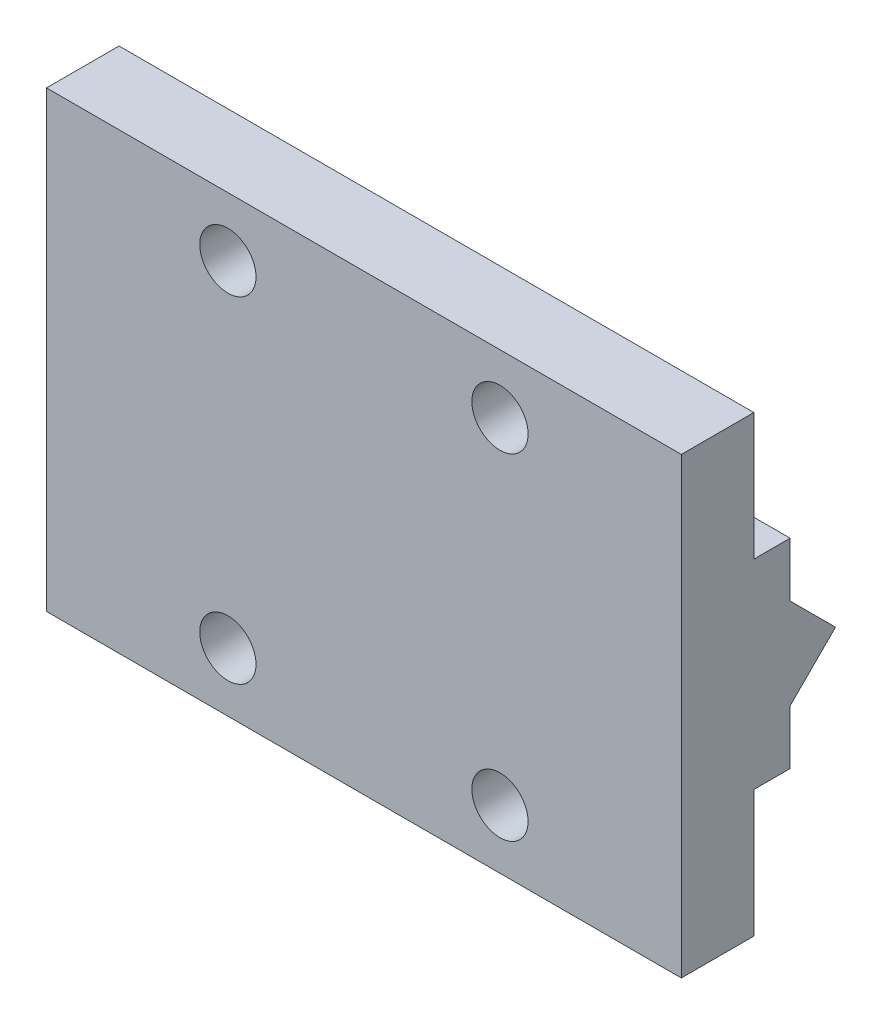
ISO-10303-21;
HEADER;
FILE_DESCRIPTION(('STEP AP214'),'2;1');
FILE_NAME('part.step','',(''),(''),'','','');
FILE_SCHEMA(('AUTOMOTIVE_DESIGN { 1 0 10303 214 1 1 1 1 }'));
ENDSEC;
DATA;
#1=APPLICATION_CONTEXT('core data for automotive mechanical design processes');
#2=APPLICATION_PROTOCOL_DEFINITION('international standard','automotive_design',2000,#1);
#3=PRODUCT_CONTEXT('',#1,'mechanical');
#4=PRODUCT('Part','Part','',(#3));
#5=PRODUCT_RELATED_PRODUCT_CATEGORY('part','',(#4));
#6=PRODUCT_DEFINITION_FORMATION('','',#4);
#7=PRODUCT_DEFINITION_CONTEXT('part definition',#1,'design');
#8=PRODUCT_DEFINITION('design','',#6,#7);
#9=PRODUCT_DEFINITION_SHAPE('','',#8);
#10=(LENGTH_UNIT() NAMED_UNIT(*) SI_UNIT(.MILLI.,.METRE.));
#11=(NAMED_UNIT(*) PLANE_ANGLE_UNIT() SI_UNIT($,.RADIAN.));
#12=(NAMED_UNIT(*) SI_UNIT($,.STERADIAN.) SOLID_ANGLE_UNIT());
#13=UNCERTAINTY_MEASURE_WITH_UNIT(LENGTH_MEASURE(1.E-05),#10,'distance_accuracy_value','');
#14=(GEOMETRIC_REPRESENTATION_CONTEXT(3) GLOBAL_UNCERTAINTY_ASSIGNED_CONTEXT((#13)) GLOBAL_UNIT_ASSIGNED_CONTEXT((#10,
#11,#12)) REPRESENTATION_CONTEXT('',''));
#15=CARTESIAN_POINT('',(0.,0.,0.));
#16=DIRECTION('',(0.,0.,1.));
#17=DIRECTION('',(1.,0.,0.));
#18=AXIS2_PLACEMENT_3D('',#15,#16,#17);
#19=CARTESIAN_POINT('',(0.,0.,-4.));
#20=DIRECTION('',(0.,0.,-1.));
#21=DIRECTION('',(-1.,0.,0.));
#22=AXIS2_PLACEMENT_3D('',#19,#20,#21);
#23=PLANE('',#22);
#24=DIRECTION('',(0.,-1.,0.));
#25=VECTOR('',#24,1.);
#26=CARTESIAN_POINT('',(23.5190615835777,10.5601173020528,-4.));
#27=LINE('',#26,#25);
#28=CARTESIAN_POINT('',(23.5190615835777,10.5601173020528,-4.));
#29=VERTEX_POINT('',#28);
#30=CARTESIAN_POINT('',(23.5190615835777,4.56011730205277,-4.));
#31=VERTEX_POINT('',#30);
#32=EDGE_CURVE('E153',#29,#31,#27,.T.);
#33=ORIENTED_EDGE('',*,*,#32,.T.);
#34=DIRECTION('',(-1.,0.,0.));
#35=VECTOR('',#34,1.);
#36=CARTESIAN_POINT('',(23.5190615835777,4.56011730205277,-4.));
#37=LINE('',#36,#35);
#38=CARTESIAN_POINT('',(-46.4809384164223,4.56011730205277,-4.));
#39=VERTEX_POINT('',#38);
#40=EDGE_CURVE('E144',#31,#39,#37,.T.);
#41=ORIENTED_EDGE('',*,*,#40,.T.);
#42=DIRECTION('',(0.,1.,0.));
#43=VECTOR('',#42,1.);
#44=CARTESIAN_POINT('',(-46.4809384164223,10.5601173020528,-4.));
#45=LINE('',#44,#43);
#46=CARTESIAN_POINT('',(-46.4809384164223,10.5601173020528,-4.));
#47=VERTEX_POINT('',#46);
#48=EDGE_CURVE('E157',#39,#47,#45,.T.);
#49=ORIENTED_EDGE('',*,*,#48,.T.);
#50=DIRECTION('',(1.,0.,0.));
#51=VECTOR('',#50,1.);
#52=CARTESIAN_POINT('',(23.5190615835777,10.5601173020528,-4.));
#53=LINE('',#52,#51);
#54=EDGE_CURVE('E161',#47,#29,#53,.T.);
#55=ORIENTED_EDGE('',*,*,#54,.T.);
#56=EDGE_LOOP('',(#33,#41,#49,#55));
#57=FACE_BOUND('',#56,.T.);
#58=ADVANCED_FACE('F41',(#57),#23,.T.);
#59=CARTESIAN_POINT('',(0.,0.,0.));
#60=DIRECTION('',(0.,0.,1.));
#61=DIRECTION('',(1.,0.,0.));
#62=AXIS2_PLACEMENT_3D('',#59,#60,#61);
#63=PLANE('',#62);
#64=CARTESIAN_POINT('',(3.5190615835777,18.0601173020528,0.));
#65=DIRECTION('',(0.,0.,1.));
#66=DIRECTION('',(1.,0.,0.));
#67=AXIS2_PLACEMENT_3D('',#64,#65,#66);
#68=CIRCLE('',#67,3.1);
#69=CARTESIAN_POINT('',(6.6190615835777,18.0601173020528,0.));
#70=VERTEX_POINT('',#69);
#71=EDGE_CURVE('E189',#70,#70,#68,.T.);
#72=ORIENTED_EDGE('',*,*,#71,.T.);
#73=EDGE_LOOP('',(#72));
#74=FACE_BOUND('',#73,.T.);
#75=CARTESIAN_POINT('',(-26.4809384164223,18.0601173020528,0.));
#76=DIRECTION('',(0.,0.,1.));
#77=DIRECTION('',(1.,0.,0.));
#78=AXIS2_PLACEMENT_3D('',#75,#76,#77);
#79=CIRCLE('',#78,3.1);
#80=CARTESIAN_POINT('',(-23.3809384164223,18.0601173020528,0.));
#81=VERTEX_POINT('',#80);
#82=EDGE_CURVE('E195',#81,#81,#79,.T.);
#83=ORIENTED_EDGE('',*,*,#82,.T.);
#84=EDGE_LOOP('',(#83));
#85=FACE_BOUND('',#84,.T.);
#86=DIRECTION('',(1.,0.,0.));
#87=VECTOR('',#86,1.);
#88=CARTESIAN_POINT('',(23.5190615835777,10.5601173020528,0.));
#89=LINE('',#88,#87);
#90=CARTESIAN_POINT('',(-46.4809384164223,10.5601173020528,0.));
#91=VERTEX_POINT('',#90);
#92=CARTESIAN_POINT('',(23.5190615835777,10.5601173020528,0.));
#93=VERTEX_POINT('',#92);
#94=EDGE_CURVE('E166',#91,#93,#89,.T.);
#95=ORIENTED_EDGE('',*,*,#94,.F.);
#96=DIRECTION('',(0.,-1.,0.));
#97=VECTOR('',#96,1.);
#98=CARTESIAN_POINT('',(-46.4809384164223,24.5601173020528,0.));
#99=LINE('',#98,#97);
#100=CARTESIAN_POINT('',(-46.4809384164223,24.5601173020528,0.));
#101=VERTEX_POINT('',#100);
#102=EDGE_CURVE('E215',#101,#91,#99,.T.);
#103=ORIENTED_EDGE('',*,*,#102,.F.);
#104=DIRECTION('',(-1.,0.,0.));
#105=VECTOR('',#104,1.);
#106=CARTESIAN_POINT('',(-46.4809384164223,24.5601173020528,0.));
#107=LINE('',#106,#105);
#108=CARTESIAN_POINT('',(23.5190615835777,24.5601173020528,0.));
#109=VERTEX_POINT('',#108);
#110=EDGE_CURVE('E208',#109,#101,#107,.T.);
#111=ORIENTED_EDGE('',*,*,#110,.F.);
#112=DIRECTION('',(0.,1.,0.));
#113=VECTOR('',#112,1.);
#114=CARTESIAN_POINT('',(23.5190615835777,24.5601173020528,0.));
#115=LINE('',#114,#113);
#116=EDGE_CURVE('E64',#93,#109,#115,.T.);
#117=ORIENTED_EDGE('',*,*,#116,.F.);
#118=EDGE_LOOP('',(#95,#103,#111,#117));
#119=FACE_BOUND('',#118,.T.);
#120=ADVANCED_FACE('F257',(#74,#85,#119),#63,.F.);
#121=CARTESIAN_POINT('',(3.51906158357771,-18.9398826979472,0.));
#122=DIRECTION('',(0.,0.,1.));
#123=DIRECTION('',(1.,0.,0.));
#124=AXIS2_PLACEMENT_3D('',#121,#122,#123);
#125=CIRCLE('',#124,3.1);
#126=CARTESIAN_POINT('',(6.61906158357771,-18.9398826979472,0.));
#127=VERTEX_POINT('',#126);
#128=EDGE_CURVE('E179',#127,#127,#125,.T.);
#129=ORIENTED_EDGE('',*,*,#128,.T.);
#130=EDGE_LOOP('',(#129));
#131=FACE_BOUND('',#130,.T.);
#132=CARTESIAN_POINT('',(-26.4809384164223,-18.9398826979472,0.));
#133=DIRECTION('',(0.,0.,1.));
#134=DIRECTION('',(1.,0.,0.));
#135=AXIS2_PLACEMENT_3D('',#132,#133,#134);
#136=CIRCLE('',#135,3.1);
#137=CARTESIAN_POINT('',(-23.3809384164223,-18.9398826979472,0.));
#138=VERTEX_POINT('',#137);
#139=EDGE_CURVE('E183',#138,#138,#136,.T.);
#140=ORIENTED_EDGE('',*,*,#139,.T.);
#141=EDGE_LOOP('',(#140));
#142=FACE_BOUND('',#141,.T.);
#143=DIRECTION('',(-1.,0.,0.));
#144=VECTOR('',#143,1.);
#145=CARTESIAN_POINT('',(23.5190615835777,-11.4398826979472,0.));
#146=LINE('',#145,#144);
#147=CARTESIAN_POINT('',(23.5190615835777,-11.4398826979472,0.));
#148=VERTEX_POINT('',#147);
#149=CARTESIAN_POINT('',(-46.4809384164223,-11.4398826979472,0.));
#150=VERTEX_POINT('',#149);
#151=EDGE_CURVE('E151',#148,#150,#146,.T.);
#152=ORIENTED_EDGE('',*,*,#151,.F.);
#153=CARTESIAN_POINT('',(23.5190615835777,-25.4398826979472,0.));
#154=VERTEX_POINT('',#153);
#155=EDGE_CURVE('E220',#154,#148,#115,.T.);
#156=ORIENTED_EDGE('',*,*,#155,.F.);
#157=DIRECTION('',(1.,0.,0.));
#158=VECTOR('',#157,1.);
#159=CARTESIAN_POINT('',(-46.4809384164223,-25.4398826979472,0.));
#160=LINE('',#159,#158);
#161=CARTESIAN_POINT('',(-46.4809384164223,-25.4398826979472,0.));
#162=VERTEX_POINT('',#161);
#163=EDGE_CURVE('E218',#162,#154,#160,.T.);
#164=ORIENTED_EDGE('',*,*,#163,.F.);
#165=EDGE_CURVE('E201',#150,#162,#99,.T.);
#166=ORIENTED_EDGE('',*,*,#165,.F.);
#167=EDGE_LOOP('',(#152,#156,#164,#166));
#168=FACE_BOUND('',#167,.T.);
#169=ADVANCED_FACE('F235',(#131,#142,#168),#63,.F.);
#170=CARTESIAN_POINT('',(0.,0.,8.));
#171=DIRECTION('',(0.,0.,1.));
#172=DIRECTION('',(1.,0.,0.));
#173=AXIS2_PLACEMENT_3D('',#170,#171,#172);
#174=PLANE('',#173);
#175=CARTESIAN_POINT('',(-26.4809384164223,-18.9398826979472,8.));
#176=DIRECTION('',(0.,0.,1.));
#177=DIRECTION('',(1.,0.,0.));
#178=AXIS2_PLACEMENT_3D('',#175,#176,#177);
#179=CIRCLE('',#178,3.1);
#180=CARTESIAN_POINT('',(-23.3809384164223,-18.9398826979472,8.));
#181=VERTEX_POINT('',#180);
#182=EDGE_CURVE('E186',#181,#181,#179,.T.);
#183=ORIENTED_EDGE('',*,*,#182,.F.);
#184=EDGE_LOOP('',(#183));
#185=FACE_BOUND('',#184,.T.);
#186=CARTESIAN_POINT('',(-26.4809384164223,18.0601173020528,8.));
#187=DIRECTION('',(0.,0.,1.));
#188=DIRECTION('',(1.,0.,0.));
#189=AXIS2_PLACEMENT_3D('',#186,#187,#188);
#190=CIRCLE('',#189,3.1);
#191=CARTESIAN_POINT('',(-23.3809384164223,18.0601173020528,8.));
#192=VERTEX_POINT('',#191);
#193=EDGE_CURVE('E198',#192,#192,#190,.T.);
#194=ORIENTED_EDGE('',*,*,#193,.F.);
#195=EDGE_LOOP('',(#194));
#196=FACE_BOUND('',#195,.T.);
#197=DIRECTION('',(0.,-1.,0.));
#198=VECTOR('',#197,1.);
#199=CARTESIAN_POINT('',(-46.4809384164223,24.5601173020528,8.));
#200=LINE('',#199,#198);
#201=CARTESIAN_POINT('',(-46.4809384164223,24.5601173020528,8.));
#202=VERTEX_POINT('',#201);
#203=CARTESIAN_POINT('',(-46.4809384164223,-25.4398826979472,8.));
#204=VERTEX_POINT('',#203);
#205=EDGE_CURVE('E204',#202,#204,#200,.T.);
#206=ORIENTED_EDGE('',*,*,#205,.T.);
#207=DIRECTION('',(1.,0.,0.));
#208=VECTOR('',#207,1.);
#209=CARTESIAN_POINT('',(-46.4809384164223,-25.4398826979472,8.));
#210=LINE('',#209,#208);
#211=CARTESIAN_POINT('',(23.5190615835777,-25.4398826979472,8.));
#212=VERTEX_POINT('',#211);
#213=EDGE_CURVE('E207',#204,#212,#210,.T.);
#214=ORIENTED_EDGE('',*,*,#213,.T.);
#215=DIRECTION('',(0.,1.,0.));
#216=VECTOR('',#215,1.);
#217=CARTESIAN_POINT('',(23.5190615835777,24.5601173020528,8.));
#218=LINE('',#217,#216);
#219=CARTESIAN_POINT('',(23.5190615835777,24.5601173020528,8.));
#220=VERTEX_POINT('',#219);
#221=EDGE_CURVE('E210',#212,#220,#218,.T.);
#222=ORIENTED_EDGE('',*,*,#221,.T.);
#223=DIRECTION('',(-1.,0.,0.));
#224=VECTOR('',#223,1.);
#225=CARTESIAN_POINT('',(-46.4809384164223,24.5601173020528,8.));
#226=LINE('',#225,#224);
#227=EDGE_CURVE('E212',#220,#202,#226,.T.);
#228=ORIENTED_EDGE('',*,*,#227,.T.);
#229=EDGE_LOOP('',(#206,#214,#222,#228));
#230=FACE_BOUND('',#229,.T.);
#231=CARTESIAN_POINT('',(3.5190615835777,18.0601173020528,8.));
#232=DIRECTION('',(0.,0.,1.));
#233=DIRECTION('',(1.,0.,0.));
#234=AXIS2_PLACEMENT_3D('',#231,#232,#233);
#235=CIRCLE('',#234,3.1);
#236=CARTESIAN_POINT('',(6.6190615835777,18.0601173020528,8.));
#237=VERTEX_POINT('',#236);
#238=EDGE_CURVE('E192',#237,#237,#235,.T.);
#239=ORIENTED_EDGE('',*,*,#238,.F.);
#240=EDGE_LOOP('',(#239));
#241=FACE_BOUND('',#240,.T.);
#242=CARTESIAN_POINT('',(3.51906158357771,-18.9398826979472,8.));
#243=DIRECTION('',(0.,0.,1.));
#244=DIRECTION('',(1.,0.,0.));
#245=AXIS2_PLACEMENT_3D('',#242,#243,#244);
#246=CIRCLE('',#245,3.1);
#247=CARTESIAN_POINT('',(6.61906158357771,-18.9398826979472,8.));
#248=VERTEX_POINT('',#247);
#249=EDGE_CURVE('E180',#248,#248,#246,.T.);
#250=ORIENTED_EDGE('',*,*,#249,.F.);
#251=EDGE_LOOP('',(#250));
#252=FACE_BOUND('',#251,.T.);
#253=ADVANCED_FACE('F276',(#185,#196,#230,#241,#252),#174,.T.);
#254=CARTESIAN_POINT('',(-46.4809384164223,24.5601173020528,8.));
#255=DIRECTION('',(1.,0.,0.));
#256=DIRECTION('',(0.,0.,-1.));
#257=AXIS2_PLACEMENT_3D('',#254,#255,#256);
#258=PLANE('',#257);
#259=ORIENTED_EDGE('',*,*,#102,.T.);
#260=DIRECTION('',(0.,0.,1.));
#261=VECTOR('',#260,1.);
#262=CARTESIAN_POINT('',(-46.4809384164223,10.5601173020528,-4.));
#263=LINE('',#262,#261);
#264=EDGE_CURVE('E170',#47,#91,#263,.T.);
#265=ORIENTED_EDGE('',*,*,#264,.F.);
#266=ORIENTED_EDGE('',*,*,#48,.F.);
#267=DIRECTION('',(0.,0.707106781186546,0.707106781186549));
#268=VECTOR('',#267,1.);
#269=CARTESIAN_POINT('',(-46.4809384164223,4.2800586510264,-4.28005865102638));
#270=LINE('',#269,#268);
#271=CARTESIAN_POINT('',(-46.4809384164223,-0.439882697947206,-9.));
#272=VERTEX_POINT('',#271);
#273=EDGE_CURVE('E56',#272,#39,#270,.T.);
#274=ORIENTED_EDGE('',*,*,#273,.F.);
#275=DIRECTION('',(0.,0.707106781186546,-0.707106781186549));
#276=VECTOR('',#275,1.);
#277=CARTESIAN_POINT('',(-46.4809384164223,-4.7199413489736,-4.71994134897358));
#278=LINE('',#277,#276);
#279=CARTESIAN_POINT('',(-46.4809384164223,-5.43988269794718,-4.));
#280=VERTEX_POINT('',#279);
#281=EDGE_CURVE('E140',#280,#272,#278,.T.);
#282=ORIENTED_EDGE('',*,*,#281,.F.);
#283=CARTESIAN_POINT('',(-46.4809384164223,-11.4398826979472,-4.));
#284=VERTEX_POINT('',#283);
#285=EDGE_CURVE('E158',#284,#280,#45,.T.);
#286=ORIENTED_EDGE('',*,*,#285,.F.);
#287=DIRECTION('',(0.,0.,1.));
#288=VECTOR('',#287,1.);
#289=CARTESIAN_POINT('',(-46.4809384164223,-11.4398826979472,-4.));
#290=LINE('',#289,#288);
#291=EDGE_CURVE('E173',#284,#150,#290,.T.);
#292=ORIENTED_EDGE('',*,*,#291,.T.);
#293=ORIENTED_EDGE('',*,*,#165,.T.);
#294=DIRECTION('',(0.,0.,-1.));
#295=VECTOR('',#294,1.);
#296=CARTESIAN_POINT('',(-46.4809384164223,-25.4398826979472,8.));
#297=LINE('',#296,#295);
#298=EDGE_CURVE('E11',#204,#162,#297,.T.);
#299=ORIENTED_EDGE('',*,*,#298,.F.);
#300=ORIENTED_EDGE('',*,*,#205,.F.);
#301=DIRECTION('',(0.,0.,-1.));
#302=VECTOR('',#301,1.);
#303=CARTESIAN_POINT('',(-46.4809384164223,24.5601173020528,8.));
#304=LINE('',#303,#302);
#305=EDGE_CURVE('E214',#202,#101,#304,.T.);
#306=ORIENTED_EDGE('',*,*,#305,.T.);
#307=EDGE_LOOP('',(#259,#265,#266,#274,#282,#286,#292,#293,#299,#300,#306));
#308=FACE_BOUND('',#307,.T.);
#309=ADVANCED_FACE('F43',(#308),#258,.F.);
#310=CARTESIAN_POINT('',(-46.4809384164223,-25.4398826979472,8.));
#311=DIRECTION('',(0.,1.,0.));
#312=DIRECTION('',(-1.,0.,0.));
#313=AXIS2_PLACEMENT_3D('',#310,#311,#312);
#314=PLANE('',#313);
#315=ORIENTED_EDGE('',*,*,#163,.T.);
#316=DIRECTION('',(0.,0.,-1.));
#317=VECTOR('',#316,1.);
#318=CARTESIAN_POINT('',(23.5190615835777,-25.4398826979472,8.));
#319=LINE('',#318,#317);
#320=EDGE_CURVE('E49',#212,#154,#319,.T.);
#321=ORIENTED_EDGE('',*,*,#320,.F.);
#322=ORIENTED_EDGE('',*,*,#213,.F.);
#323=ORIENTED_EDGE('',*,*,#298,.T.);
#324=EDGE_LOOP('',(#315,#321,#322,#323));
#325=FACE_BOUND('',#324,.T.);
#326=ADVANCED_FACE('F278',(#325),#314,.F.);
#327=CARTESIAN_POINT('',(23.5190615835777,24.5601173020528,8.));
#328=DIRECTION('',(-1.,0.,0.));
#329=DIRECTION('',(0.,0.,1.));
#330=AXIS2_PLACEMENT_3D('',#327,#328,#329);
#331=PLANE('',#330);
#332=ORIENTED_EDGE('',*,*,#155,.T.);
#333=DIRECTION('',(0.,0.,1.));
#334=VECTOR('',#333,1.);
#335=CARTESIAN_POINT('',(23.5190615835777,-11.4398826979472,-4.));
#336=LINE('',#335,#334);
#337=CARTESIAN_POINT('',(23.5190615835777,-11.4398826979472,-4.));
#338=VERTEX_POINT('',#337);
#339=EDGE_CURVE('E176',#338,#148,#336,.T.);
#340=ORIENTED_EDGE('',*,*,#339,.F.);
#341=CARTESIAN_POINT('',(23.5190615835777,-5.43988269794718,-4.));
#342=VERTEX_POINT('',#341);
#343=EDGE_CURVE('E133',#342,#338,#27,.T.);
#344=ORIENTED_EDGE('',*,*,#343,.F.);
#345=DIRECTION('',(0.,0.707106781186546,-0.707106781186549));
#346=VECTOR('',#345,1.);
#347=CARTESIAN_POINT('',(23.5190615835777,-4.7199413489736,-4.71994134897358));
#348=LINE('',#347,#346);
#349=CARTESIAN_POINT('',(23.5190615835777,-0.439882697947206,-9.));
#350=VERTEX_POINT('',#349);
#351=EDGE_CURVE('E125',#342,#350,#348,.T.);
#352=ORIENTED_EDGE('',*,*,#351,.T.);
#353=DIRECTION('',(0.,0.707106781186546,0.707106781186549));
#354=VECTOR('',#353,1.);
#355=CARTESIAN_POINT('',(23.5190615835777,4.2800586510264,-4.28005865102638));
#356=LINE('',#355,#354);
#357=EDGE_CURVE('E131',#350,#31,#356,.T.);
#358=ORIENTED_EDGE('',*,*,#357,.T.);
#359=ORIENTED_EDGE('',*,*,#32,.F.);
#360=DIRECTION('',(0.,0.,1.));
#361=VECTOR('',#360,1.);
#362=CARTESIAN_POINT('',(23.5190615835777,10.5601173020528,-4.));
#363=LINE('',#362,#361);
#364=EDGE_CURVE('E163',#29,#93,#363,.T.);
#365=ORIENTED_EDGE('',*,*,#364,.T.);
#366=ORIENTED_EDGE('',*,*,#116,.T.);
#367=DIRECTION('',(0.,0.,-1.));
#368=VECTOR('',#367,1.);
#369=CARTESIAN_POINT('',(23.5190615835777,24.5601173020528,8.));
#370=LINE('',#369,#368);
#371=EDGE_CURVE('E225',#220,#109,#370,.T.);
#372=ORIENTED_EDGE('',*,*,#371,.F.);
#373=ORIENTED_EDGE('',*,*,#221,.F.);
#374=ORIENTED_EDGE('',*,*,#320,.T.);
#375=EDGE_LOOP('',(#332,#340,#344,#352,#358,#359,#365,#366,#372,#373,#374));
#376=FACE_BOUND('',#375,.T.);
#377=ADVANCED_FACE('F128',(#376),#331,.F.);
#378=CARTESIAN_POINT('',(-46.4809384164223,24.5601173020528,8.));
#379=DIRECTION('',(0.,-1.,0.));
#380=DIRECTION('',(0.,0.,-1.));
#381=AXIS2_PLACEMENT_3D('',#378,#379,#380);
#382=PLANE('',#381);
#383=ORIENTED_EDGE('',*,*,#110,.T.);
#384=ORIENTED_EDGE('',*,*,#305,.F.);
#385=ORIENTED_EDGE('',*,*,#227,.F.);
#386=ORIENTED_EDGE('',*,*,#371,.T.);
#387=EDGE_LOOP('',(#383,#384,#385,#386));
#388=FACE_BOUND('',#387,.T.);
#389=ADVANCED_FACE('F274',(#388),#382,.F.);
#390=CARTESIAN_POINT('',(-26.4809384164223,18.0601173020528,8.));
#391=DIRECTION('',(0.,0.,-1.));
#392=DIRECTION('',(-1.,0.,0.));
#393=AXIS2_PLACEMENT_3D('',#390,#391,#392);
#394=CYLINDRICAL_SURFACE('',#393,3.1);
#395=ORIENTED_EDGE('',*,*,#193,.T.);
#396=EDGE_LOOP('',(#395));
#397=FACE_BOUND('',#396,.T.);
#398=ORIENTED_EDGE('',*,*,#82,.F.);
#399=EDGE_LOOP('',(#398));
#400=FACE_BOUND('',#399,.T.);
#401=ADVANCED_FACE('F286',(#397,#400),#394,.F.);
#402=CARTESIAN_POINT('',(3.5190615835777,18.0601173020528,8.));
#403=DIRECTION('',(0.,0.,-1.));
#404=DIRECTION('',(-1.,0.,0.));
#405=AXIS2_PLACEMENT_3D('',#402,#403,#404);
#406=CYLINDRICAL_SURFACE('',#405,3.1);
#407=ORIENTED_EDGE('',*,*,#238,.T.);
#408=EDGE_LOOP('',(#407));
#409=FACE_BOUND('',#408,.T.);
#410=ORIENTED_EDGE('',*,*,#71,.F.);
#411=EDGE_LOOP('',(#410));
#412=FACE_BOUND('',#411,.T.);
#413=ADVANCED_FACE('F292',(#409,#412),#406,.F.);
#414=CARTESIAN_POINT('',(-26.4809384164223,-18.9398826979472,8.));
#415=DIRECTION('',(0.,0.,-1.));
#416=DIRECTION('',(-1.,0.,0.));
#417=AXIS2_PLACEMENT_3D('',#414,#415,#416);
#418=CYLINDRICAL_SURFACE('',#417,3.1);
#419=ORIENTED_EDGE('',*,*,#182,.T.);
#420=EDGE_LOOP('',(#419));
#421=FACE_BOUND('',#420,.T.);
#422=ORIENTED_EDGE('',*,*,#139,.F.);
#423=EDGE_LOOP('',(#422));
#424=FACE_BOUND('',#423,.T.);
#425=ADVANCED_FACE('F296',(#421,#424),#418,.F.);
#426=CARTESIAN_POINT('',(3.51906158357771,-18.9398826979472,8.));
#427=DIRECTION('',(0.,0.,-1.));
#428=DIRECTION('',(-1.,0.,0.));
#429=AXIS2_PLACEMENT_3D('',#426,#427,#428);
#430=CYLINDRICAL_SURFACE('',#429,3.1);
#431=ORIENTED_EDGE('',*,*,#249,.T.);
#432=EDGE_LOOP('',(#431));
#433=FACE_BOUND('',#432,.T.);
#434=ORIENTED_EDGE('',*,*,#128,.F.);
#435=EDGE_LOOP('',(#434));
#436=FACE_BOUND('',#435,.T.);
#437=ADVANCED_FACE('F300',(#433,#436),#430,.F.);
#438=CARTESIAN_POINT('',(23.5190615835777,-11.4398826979472,-4.));
#439=DIRECTION('',(0.,1.,0.));
#440=DIRECTION('',(-1.,0.,0.));
#441=AXIS2_PLACEMENT_3D('',#438,#439,#440);
#442=PLANE('',#441);
#443=ORIENTED_EDGE('',*,*,#151,.T.);
#444=ORIENTED_EDGE('',*,*,#291,.F.);
#445=DIRECTION('',(-1.,0.,0.));
#446=VECTOR('',#445,1.);
#447=CARTESIAN_POINT('',(23.5190615835777,-11.4398826979472,-4.));
#448=LINE('',#447,#446);
#449=EDGE_CURVE('E155',#338,#284,#448,.T.);
#450=ORIENTED_EDGE('',*,*,#449,.F.);
#451=ORIENTED_EDGE('',*,*,#339,.T.);
#452=EDGE_LOOP('',(#443,#444,#450,#451));
#453=FACE_BOUND('',#452,.T.);
#454=ADVANCED_FACE('F238',(#453),#442,.F.);
#455=CARTESIAN_POINT('',(23.5190615835777,10.5601173020528,-4.));
#456=DIRECTION('',(0.,-1.,0.));
#457=DIRECTION('',(0.,0.,-1.));
#458=AXIS2_PLACEMENT_3D('',#455,#456,#457);
#459=PLANE('',#458);
#460=ORIENTED_EDGE('',*,*,#94,.T.);
#461=ORIENTED_EDGE('',*,*,#364,.F.);
#462=ORIENTED_EDGE('',*,*,#54,.F.);
#463=ORIENTED_EDGE('',*,*,#264,.T.);
#464=EDGE_LOOP('',(#460,#461,#462,#463));
#465=FACE_BOUND('',#464,.T.);
#466=ADVANCED_FACE('F246',(#465),#459,.F.);
#467=DIRECTION('',(-1.,0.,0.));
#468=VECTOR('',#467,1.);
#469=CARTESIAN_POINT('',(23.5190615835777,-5.43988269794718,-4.));
#470=LINE('',#469,#468);
#471=EDGE_CURVE('E141',#342,#280,#470,.T.);
#472=ORIENTED_EDGE('',*,*,#471,.F.);
#473=ORIENTED_EDGE('',*,*,#343,.T.);
#474=ORIENTED_EDGE('',*,*,#449,.T.);
#475=ORIENTED_EDGE('',*,*,#285,.T.);
#476=EDGE_LOOP('',(#472,#473,#474,#475));
#477=FACE_BOUND('',#476,.T.);
#478=ADVANCED_FACE('F244',(#477),#23,.T.);
#479=CARTESIAN_POINT('',(23.5190615835777,4.2800586510264,-4.28005865102638));
#480=DIRECTION('',(0.,-0.707106781186549,0.707106781186546));
#481=DIRECTION('',(0.,-0.707106781186546,-0.707106781186549));
#482=AXIS2_PLACEMENT_3D('',#479,#480,#481);
#483=PLANE('',#482);
#484=ORIENTED_EDGE('',*,*,#273,.T.);
#485=ORIENTED_EDGE('',*,*,#40,.F.);
#486=ORIENTED_EDGE('',*,*,#357,.F.);
#487=DIRECTION('',(-1.,0.,0.));
#488=VECTOR('',#487,1.);
#489=CARTESIAN_POINT('',(23.5190615835777,-0.439882697947206,-9.));
#490=LINE('',#489,#488);
#491=EDGE_CURVE('E136',#350,#272,#490,.T.);
#492=ORIENTED_EDGE('',*,*,#491,.T.);
#493=EDGE_LOOP('',(#484,#485,#486,#492));
#494=FACE_BOUND('',#493,.T.);
#495=ADVANCED_FACE('F143',(#494),#483,.F.);
#496=CARTESIAN_POINT('',(23.5190615835777,-4.7199413489736,-4.71994134897358));
#497=DIRECTION('',(0.,0.707106781186549,0.707106781186546));
#498=DIRECTION('',(0.,-0.707106781186546,0.707106781186549));
#499=AXIS2_PLACEMENT_3D('',#496,#497,#498);
#500=PLANE('',#499);
#501=ORIENTED_EDGE('',*,*,#281,.T.);
#502=ORIENTED_EDGE('',*,*,#491,.F.);
#503=ORIENTED_EDGE('',*,*,#351,.F.);
#504=ORIENTED_EDGE('',*,*,#471,.T.);
#505=EDGE_LOOP('',(#501,#502,#503,#504));
#506=FACE_BOUND('',#505,.T.);
#507=ADVANCED_FACE('F138',(#506),#500,.F.);
#508=CLOSED_SHELL('',(#58,#120,#169,#253,#309,#326,#377,#389,#401,#413,#425,#437,#454,#466,#478,
#495,#507));
#509=MANIFOLD_SOLID_BREP('B2',#508);
#510=ADVANCED_BREP_SHAPE_REPRESENTATION('',(#18,#509),#14);
#511=SHAPE_DEFINITION_REPRESENTATION(#9,#510);
ENDSEC;
END-ISO-10303-21;
